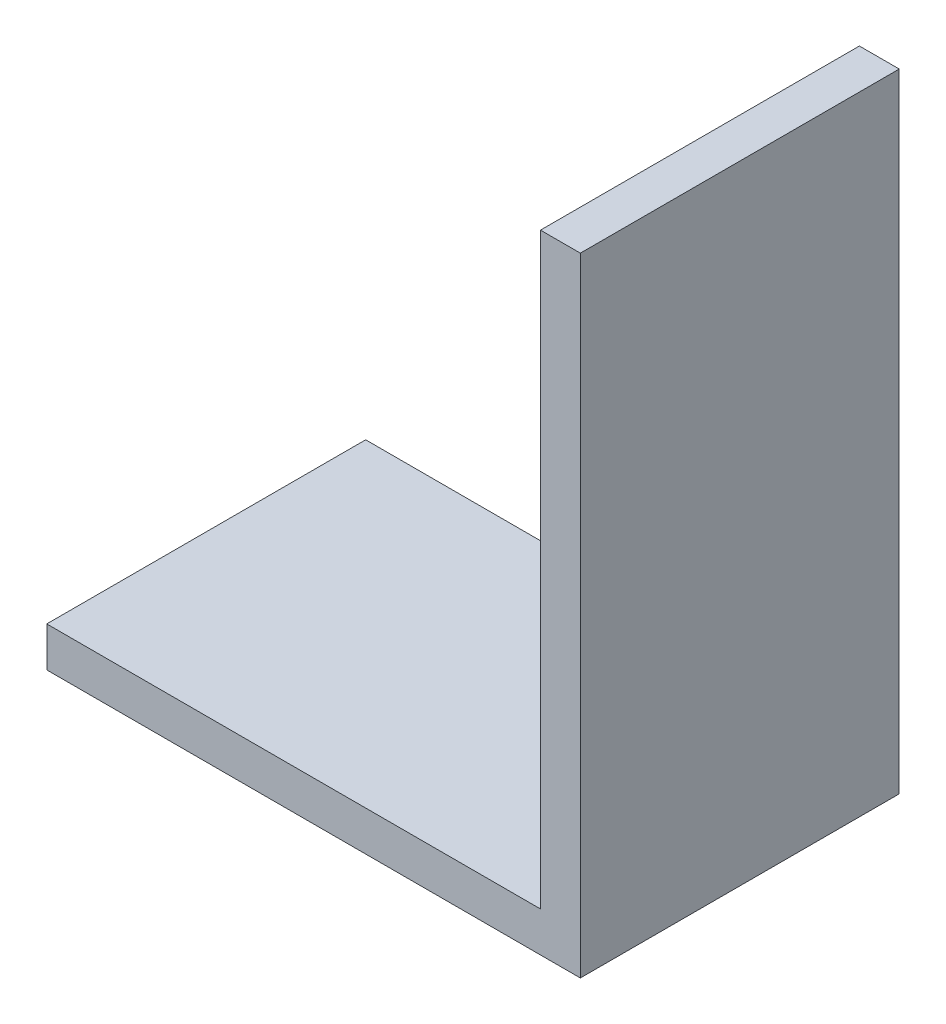
ISO-10303-21;
HEADER;
FILE_DESCRIPTION(('STEP AP214'),'2;1');
FILE_NAME('part.step','',(''),(''),'','','');
FILE_SCHEMA(('AUTOMOTIVE_DESIGN { 1 0 10303 214 1 1 1 1 }'));
ENDSEC;
DATA;
#1=APPLICATION_CONTEXT('core data for automotive mechanical design processes');
#2=APPLICATION_PROTOCOL_DEFINITION('international standard','automotive_design',2000,#1);
#3=PRODUCT_CONTEXT('',#1,'mechanical');
#4=PRODUCT('Part','Part','',(#3));
#5=PRODUCT_RELATED_PRODUCT_CATEGORY('part','',(#4));
#6=PRODUCT_DEFINITION_FORMATION('','',#4);
#7=PRODUCT_DEFINITION_CONTEXT('part definition',#1,'design');
#8=PRODUCT_DEFINITION('design','',#6,#7);
#9=PRODUCT_DEFINITION_SHAPE('','',#8);
#10=(LENGTH_UNIT() NAMED_UNIT(*) SI_UNIT(.MILLI.,.METRE.));
#11=(NAMED_UNIT(*) PLANE_ANGLE_UNIT() SI_UNIT($,.RADIAN.));
#12=(NAMED_UNIT(*) SI_UNIT($,.STERADIAN.) SOLID_ANGLE_UNIT());
#13=UNCERTAINTY_MEASURE_WITH_UNIT(LENGTH_MEASURE(1.E-05),#10,'distance_accuracy_value','');
#14=(GEOMETRIC_REPRESENTATION_CONTEXT(3) GLOBAL_UNCERTAINTY_ASSIGNED_CONTEXT((#13)) GLOBAL_UNIT_ASSIGNED_CONTEXT((#10,
#11,#12)) REPRESENTATION_CONTEXT('',''));
#15=CARTESIAN_POINT('',(0.,0.,0.));
#16=DIRECTION('',(0.,0.,1.));
#17=DIRECTION('',(1.,0.,0.));
#18=AXIS2_PLACEMENT_3D('',#15,#16,#17);
#19=CARTESIAN_POINT('',(0.,200.,50.8));
#20=DIRECTION('',(0.,-1.,0.));
#21=DIRECTION('',(0.,0.,-1.));
#22=AXIS2_PLACEMENT_3D('',#19,#20,#21);
#23=PLANE('',#22);
#24=DIRECTION('',(-1.,0.,0.));
#25=VECTOR('',#24,1.);
#26=CARTESIAN_POINT('',(0.,200.,-50.8));
#27=LINE('',#26,#25);
#28=CARTESIAN_POINT('',(0.,200.,-50.8));
#29=VERTEX_POINT('',#28);
#30=CARTESIAN_POINT('',(-12.7,200.,-50.8));
#31=VERTEX_POINT('',#30);
#32=EDGE_CURVE('E117',#29,#31,#27,.T.);
#33=ORIENTED_EDGE('',*,*,#32,.T.);
#34=DIRECTION('',(0.,0.,-1.));
#35=VECTOR('',#34,1.);
#36=CARTESIAN_POINT('',(-12.7,200.,50.8));
#37=LINE('',#36,#35);
#38=CARTESIAN_POINT('',(-12.7,200.,50.8));
#39=VERTEX_POINT('',#38);
#40=EDGE_CURVE('E11',#39,#31,#37,.T.);
#41=ORIENTED_EDGE('',*,*,#40,.F.);
#42=DIRECTION('',(-1.,0.,0.));
#43=VECTOR('',#42,1.);
#44=CARTESIAN_POINT('',(0.,200.,50.8));
#45=LINE('',#44,#43);
#46=CARTESIAN_POINT('',(0.,200.,50.8));
#47=VERTEX_POINT('',#46);
#48=EDGE_CURVE('E127',#47,#39,#45,.T.);
#49=ORIENTED_EDGE('',*,*,#48,.F.);
#50=DIRECTION('',(0.,0.,-1.));
#51=VECTOR('',#50,1.);
#52=CARTESIAN_POINT('',(0.,200.,50.8));
#53=LINE('',#52,#51);
#54=EDGE_CURVE('E113',#47,#29,#53,.T.);
#55=ORIENTED_EDGE('',*,*,#54,.T.);
#56=EDGE_LOOP('',(#33,#41,#49,#55));
#57=FACE_BOUND('',#56,.T.);
#58=ADVANCED_FACE('F33',(#57),#23,.F.);
#59=CARTESIAN_POINT('',(-12.7,200.,50.8));
#60=DIRECTION('',(1.,0.,0.));
#61=DIRECTION('',(0.,1.,0.));
#62=AXIS2_PLACEMENT_3D('',#59,#60,#61);
#63=PLANE('',#62);
#64=DIRECTION('',(0.,-1.,0.));
#65=VECTOR('',#64,1.);
#66=CARTESIAN_POINT('',(-12.7,200.,-50.8));
#67=LINE('',#66,#65);
#68=CARTESIAN_POINT('',(-12.7,12.7,-50.8));
#69=VERTEX_POINT('',#68);
#70=EDGE_CURVE('E120',#31,#69,#67,.T.);
#71=ORIENTED_EDGE('',*,*,#70,.T.);
#72=DIRECTION('',(0.,0.,-1.));
#73=VECTOR('',#72,1.);
#74=CARTESIAN_POINT('',(-12.7,12.7,50.8));
#75=LINE('',#74,#73);
#76=CARTESIAN_POINT('',(-12.7,12.7,50.8));
#77=VERTEX_POINT('',#76);
#78=EDGE_CURVE('E41',#77,#69,#75,.T.);
#79=ORIENTED_EDGE('',*,*,#78,.F.);
#80=DIRECTION('',(0.,-1.,0.));
#81=VECTOR('',#80,1.);
#82=CARTESIAN_POINT('',(-12.7,200.,50.8));
#83=LINE('',#82,#81);
#84=EDGE_CURVE('E86',#39,#77,#83,.T.);
#85=ORIENTED_EDGE('',*,*,#84,.F.);
#86=ORIENTED_EDGE('',*,*,#40,.T.);
#87=EDGE_LOOP('',(#71,#79,#85,#86));
#88=FACE_BOUND('',#87,.T.);
#89=ADVANCED_FACE('F151',(#88),#63,.F.);
#90=CARTESIAN_POINT('',(-12.7,12.7,50.8));
#91=DIRECTION('',(0.,-1.,0.));
#92=DIRECTION('',(1.,0.,0.));
#93=AXIS2_PLACEMENT_3D('',#90,#91,#92);
#94=PLANE('',#93);
#95=DIRECTION('',(-1.,0.,0.));
#96=VECTOR('',#95,1.);
#97=CARTESIAN_POINT('',(-12.7,12.7,-50.8));
#98=LINE('',#97,#96);
#99=CARTESIAN_POINT('',(-170.,12.7,-50.8));
#100=VERTEX_POINT('',#99);
#101=EDGE_CURVE('E122',#69,#100,#98,.T.);
#102=ORIENTED_EDGE('',*,*,#101,.T.);
#103=DIRECTION('',(0.,0.,-1.));
#104=VECTOR('',#103,1.);
#105=CARTESIAN_POINT('',(-170.,12.7,50.8));
#106=LINE('',#105,#104);
#107=CARTESIAN_POINT('',(-170.,12.7,50.8));
#108=VERTEX_POINT('',#107);
#109=EDGE_CURVE('E108',#108,#100,#106,.T.);
#110=ORIENTED_EDGE('',*,*,#109,.F.);
#111=DIRECTION('',(-1.,0.,0.));
#112=VECTOR('',#111,1.);
#113=CARTESIAN_POINT('',(-12.7,12.7,50.8));
#114=LINE('',#113,#112);
#115=EDGE_CURVE('E99',#77,#108,#114,.T.);
#116=ORIENTED_EDGE('',*,*,#115,.F.);
#117=ORIENTED_EDGE('',*,*,#78,.T.);
#118=EDGE_LOOP('',(#102,#110,#116,#117));
#119=FACE_BOUND('',#118,.T.);
#120=ADVANCED_FACE('F133',(#119),#94,.F.);
#121=CARTESIAN_POINT('',(-170.,0.,50.8));
#122=DIRECTION('',(1.,0.,0.));
#123=DIRECTION('',(0.,0.,-1.));
#124=AXIS2_PLACEMENT_3D('',#121,#122,#123);
#125=PLANE('',#124);
#126=DIRECTION('',(0.,-1.,0.));
#127=VECTOR('',#126,1.);
#128=CARTESIAN_POINT('',(-170.,0.,-50.8));
#129=LINE('',#128,#127);
#130=CARTESIAN_POINT('',(-170.,0.,-50.8));
#131=VERTEX_POINT('',#130);
#132=EDGE_CURVE('E107',#100,#131,#129,.T.);
#133=ORIENTED_EDGE('',*,*,#132,.T.);
#134=DIRECTION('',(0.,0.,-1.));
#135=VECTOR('',#134,1.);
#136=CARTESIAN_POINT('',(-170.,0.,50.8));
#137=LINE('',#136,#135);
#138=CARTESIAN_POINT('',(-170.,0.,50.8));
#139=VERTEX_POINT('',#138);
#140=EDGE_CURVE('E104',#139,#131,#137,.T.);
#141=ORIENTED_EDGE('',*,*,#140,.F.);
#142=DIRECTION('',(0.,-1.,0.));
#143=VECTOR('',#142,1.);
#144=CARTESIAN_POINT('',(-170.,0.,50.8));
#145=LINE('',#144,#143);
#146=EDGE_CURVE('E93',#108,#139,#145,.T.);
#147=ORIENTED_EDGE('',*,*,#146,.F.);
#148=ORIENTED_EDGE('',*,*,#109,.T.);
#149=EDGE_LOOP('',(#133,#141,#147,#148));
#150=FACE_BOUND('',#149,.T.);
#151=ADVANCED_FACE('F105',(#150),#125,.F.);
#152=CARTESIAN_POINT('',(0.,0.,50.8));
#153=DIRECTION('',(0.,1.,0.));
#154=DIRECTION('',(-1.,0.,0.));
#155=AXIS2_PLACEMENT_3D('',#152,#153,#154);
#156=PLANE('',#155);
#157=DIRECTION('',(1.,0.,0.));
#158=VECTOR('',#157,1.);
#159=CARTESIAN_POINT('',(0.,0.,-50.8));
#160=LINE('',#159,#158);
#161=CARTESIAN_POINT('',(0.,0.,-50.8));
#162=VERTEX_POINT('',#161);
#163=EDGE_CURVE('E72',#131,#162,#160,.T.);
#164=ORIENTED_EDGE('',*,*,#163,.T.);
#165=DIRECTION('',(0.,0.,-1.));
#166=VECTOR('',#165,1.);
#167=CARTESIAN_POINT('',(0.,0.,50.8));
#168=LINE('',#167,#166);
#169=CARTESIAN_POINT('',(0.,0.,50.8));
#170=VERTEX_POINT('',#169);
#171=EDGE_CURVE('E109',#170,#162,#168,.T.);
#172=ORIENTED_EDGE('',*,*,#171,.F.);
#173=DIRECTION('',(1.,0.,0.));
#174=VECTOR('',#173,1.);
#175=CARTESIAN_POINT('',(0.,0.,50.8));
#176=LINE('',#175,#174);
#177=EDGE_CURVE('E97',#139,#170,#176,.T.);
#178=ORIENTED_EDGE('',*,*,#177,.F.);
#179=ORIENTED_EDGE('',*,*,#140,.T.);
#180=EDGE_LOOP('',(#164,#172,#178,#179));
#181=FACE_BOUND('',#180,.T.);
#182=ADVANCED_FACE('F111',(#181),#156,.F.);
#183=CARTESIAN_POINT('',(0.,200.,50.8));
#184=DIRECTION('',(-1.,0.,0.));
#185=DIRECTION('',(0.,-1.,0.));
#186=AXIS2_PLACEMENT_3D('',#183,#184,#185);
#187=PLANE('',#186);
#188=DIRECTION('',(0.,1.,0.));
#189=VECTOR('',#188,1.);
#190=CARTESIAN_POINT('',(0.,200.,-50.8));
#191=LINE('',#190,#189);
#192=EDGE_CURVE('E78',#162,#29,#191,.T.);
#193=ORIENTED_EDGE('',*,*,#192,.T.);
#194=ORIENTED_EDGE('',*,*,#54,.F.);
#195=DIRECTION('',(0.,1.,0.));
#196=VECTOR('',#195,1.);
#197=CARTESIAN_POINT('',(0.,200.,50.8));
#198=LINE('',#197,#196);
#199=EDGE_CURVE('E49',#170,#47,#198,.T.);
#200=ORIENTED_EDGE('',*,*,#199,.F.);
#201=ORIENTED_EDGE('',*,*,#171,.T.);
#202=EDGE_LOOP('',(#193,#194,#200,#201));
#203=FACE_BOUND('',#202,.T.);
#204=ADVANCED_FACE('F140',(#203),#187,.F.);
#205=CARTESIAN_POINT('',(0.,0.,50.8));
#206=DIRECTION('',(0.,0.,1.));
#207=DIRECTION('',(1.,0.,0.));
#208=AXIS2_PLACEMENT_3D('',#205,#206,#207);
#209=PLANE('',#208);
#210=ORIENTED_EDGE('',*,*,#48,.T.);
#211=ORIENTED_EDGE('',*,*,#84,.T.);
#212=ORIENTED_EDGE('',*,*,#115,.T.);
#213=ORIENTED_EDGE('',*,*,#146,.T.);
#214=ORIENTED_EDGE('',*,*,#177,.T.);
#215=ORIENTED_EDGE('',*,*,#199,.T.);
#216=EDGE_LOOP('',(#210,#211,#212,#213,#214,#215));
#217=FACE_BOUND('',#216,.T.);
#218=ADVANCED_FACE('F95',(#217),#209,.T.);
#219=CARTESIAN_POINT('',(0.,0.,-50.8));
#220=DIRECTION('',(0.,0.,1.));
#221=DIRECTION('',(1.,0.,0.));
#222=AXIS2_PLACEMENT_3D('',#219,#220,#221);
#223=PLANE('',#222);
#224=ORIENTED_EDGE('',*,*,#32,.F.);
#225=ORIENTED_EDGE('',*,*,#192,.F.);
#226=ORIENTED_EDGE('',*,*,#163,.F.);
#227=ORIENTED_EDGE('',*,*,#132,.F.);
#228=ORIENTED_EDGE('',*,*,#101,.F.);
#229=ORIENTED_EDGE('',*,*,#70,.F.);
#230=EDGE_LOOP('',(#224,#225,#226,#227,#228,#229));
#231=FACE_BOUND('',#230,.T.);
#232=ADVANCED_FACE('F136',(#231),#223,.F.);
#233=CLOSED_SHELL('',(#58,#89,#120,#151,#182,#204,#218,#232));
#234=MANIFOLD_SOLID_BREP('B2',#233);
#235=ADVANCED_BREP_SHAPE_REPRESENTATION('',(#18,#234),#14);
#236=SHAPE_DEFINITION_REPRESENTATION(#9,#235);
ENDSEC;
END-ISO-10303-21;
